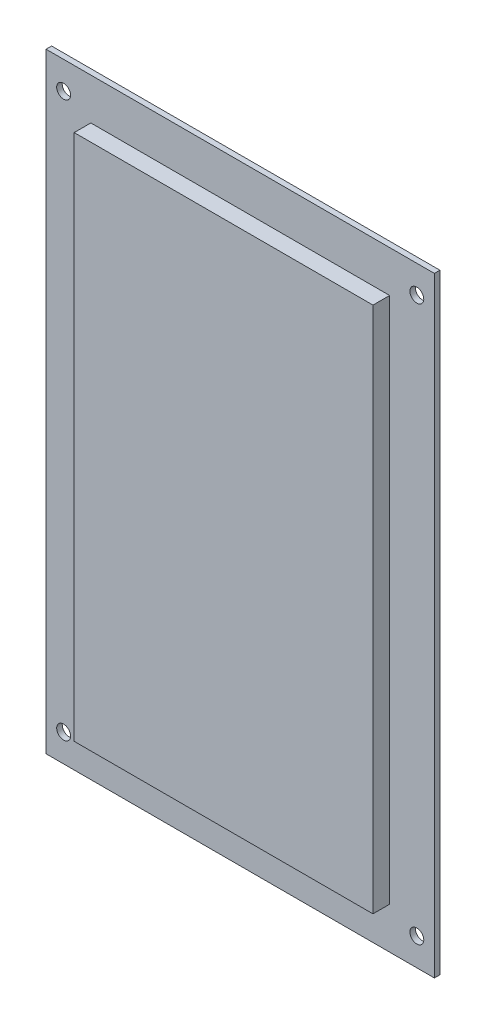
ISO-10303-21;
HEADER;
FILE_DESCRIPTION(('STEP AP214'),'2;1');
FILE_NAME('part.step','',(''),(''),'','','');
FILE_SCHEMA(('AUTOMOTIVE_DESIGN { 1 0 10303 214 1 1 1 1 }'));
ENDSEC;
DATA;
#1=APPLICATION_CONTEXT('core data for automotive mechanical design processes');
#2=APPLICATION_PROTOCOL_DEFINITION('international standard','automotive_design',2000,#1);
#3=PRODUCT_CONTEXT('',#1,'mechanical');
#4=PRODUCT('Part','Part','',(#3));
#5=PRODUCT_RELATED_PRODUCT_CATEGORY('part','',(#4));
#6=PRODUCT_DEFINITION_FORMATION('','',#4);
#7=PRODUCT_DEFINITION_CONTEXT('part definition',#1,'design');
#8=PRODUCT_DEFINITION('design','',#6,#7);
#9=PRODUCT_DEFINITION_SHAPE('','',#8);
#10=(LENGTH_UNIT() NAMED_UNIT(*) SI_UNIT(.MILLI.,.METRE.));
#11=(NAMED_UNIT(*) PLANE_ANGLE_UNIT() SI_UNIT($,.RADIAN.));
#12=(NAMED_UNIT(*) SI_UNIT($,.STERADIAN.) SOLID_ANGLE_UNIT());
#13=UNCERTAINTY_MEASURE_WITH_UNIT(LENGTH_MEASURE(1.E-05),#10,'distance_accuracy_value','');
#14=(GEOMETRIC_REPRESENTATION_CONTEXT(3) GLOBAL_UNCERTAINTY_ASSIGNED_CONTEXT((#13)) GLOBAL_UNIT_ASSIGNED_CONTEXT((#10,
#11,#12)) REPRESENTATION_CONTEXT('',''));
#15=CARTESIAN_POINT('',(0.,0.,0.));
#16=DIRECTION('',(0.,0.,1.));
#17=DIRECTION('',(1.,0.,0.));
#18=AXIS2_PLACEMENT_3D('',#15,#16,#17);
#19=CARTESIAN_POINT('',(-20.0170068027211,43.5850340136054,3.));
#20=DIRECTION('',(1.,0.,0.));
#21=DIRECTION('',(0.,1.,0.));
#22=AXIS2_PLACEMENT_3D('',#19,#20,#21);
#23=PLANE('',#22);
#24=DIRECTION('',(0.,-1.,0.));
#25=VECTOR('',#24,1.);
#26=CARTESIAN_POINT('',(-20.0170068027211,43.5850340136054,0.));
#27=LINE('',#26,#25);
#28=CARTESIAN_POINT('',(-20.0170068027211,43.5850340136054,0.));
#29=VERTEX_POINT('',#28);
#30=CARTESIAN_POINT('',(-20.0170068027211,-51.4549659863945,0.));
#31=VERTEX_POINT('',#30);
#32=EDGE_CURVE('E139',#29,#31,#27,.T.);
#33=ORIENTED_EDGE('',*,*,#32,.T.);
#34=DIRECTION('',(0.,0.,-1.));
#35=VECTOR('',#34,1.);
#36=CARTESIAN_POINT('',(-20.0170068027211,-51.4549659863945,3.));
#37=LINE('',#36,#35);
#38=CARTESIAN_POINT('',(-20.0170068027211,-51.4549659863945,3.));
#39=VERTEX_POINT('',#38);
#40=EDGE_CURVE('E11',#39,#31,#37,.T.);
#41=ORIENTED_EDGE('',*,*,#40,.F.);
#42=DIRECTION('',(0.,-1.,0.));
#43=VECTOR('',#42,1.);
#44=CARTESIAN_POINT('',(-20.0170068027211,43.5850340136054,3.));
#45=LINE('',#44,#43);
#46=CARTESIAN_POINT('',(-20.0170068027211,43.5850340136054,3.));
#47=VERTEX_POINT('',#46);
#48=EDGE_CURVE('E150',#47,#39,#45,.T.);
#49=ORIENTED_EDGE('',*,*,#48,.F.);
#50=DIRECTION('',(0.,0.,-1.));
#51=VECTOR('',#50,1.);
#52=CARTESIAN_POINT('',(-20.0170068027211,43.5850340136054,3.));
#53=LINE('',#52,#51);
#54=EDGE_CURVE('E161',#47,#29,#53,.T.);
#55=ORIENTED_EDGE('',*,*,#54,.T.);
#56=EDGE_LOOP('',(#33,#41,#49,#55));
#57=FACE_BOUND('',#56,.T.);
#58=ADVANCED_FACE('F49',(#57),#23,.F.);
#59=CARTESIAN_POINT('',(-20.0170068027211,-51.4549659863945,3.));
#60=DIRECTION('',(0.,1.,0.));
#61=DIRECTION('',(-1.,0.,0.));
#62=AXIS2_PLACEMENT_3D('',#59,#60,#61);
#63=PLANE('',#62);
#64=DIRECTION('',(1.,0.,0.));
#65=VECTOR('',#64,1.);
#66=CARTESIAN_POINT('',(-20.0170068027211,-51.4549659863945,0.));
#67=LINE('',#66,#65);
#68=CARTESIAN_POINT('',(33.8429931972789,-51.4549659863945,0.));
#69=VERTEX_POINT('',#68);
#70=EDGE_CURVE('E144',#31,#69,#67,.T.);
#71=ORIENTED_EDGE('',*,*,#70,.T.);
#72=DIRECTION('',(0.,0.,-1.));
#73=VECTOR('',#72,1.);
#74=CARTESIAN_POINT('',(33.8429931972789,-51.4549659863945,3.));
#75=LINE('',#74,#73);
#76=CARTESIAN_POINT('',(33.8429931972789,-51.4549659863945,3.));
#77=VERTEX_POINT('',#76);
#78=EDGE_CURVE('E58',#77,#69,#75,.T.);
#79=ORIENTED_EDGE('',*,*,#78,.F.);
#80=DIRECTION('',(1.,0.,0.));
#81=VECTOR('',#80,1.);
#82=CARTESIAN_POINT('',(-20.0170068027211,-51.4549659863945,3.));
#83=LINE('',#82,#81);
#84=EDGE_CURVE('E153',#39,#77,#83,.T.);
#85=ORIENTED_EDGE('',*,*,#84,.F.);
#86=ORIENTED_EDGE('',*,*,#40,.T.);
#87=EDGE_LOOP('',(#71,#79,#85,#86));
#88=FACE_BOUND('',#87,.T.);
#89=ADVANCED_FACE('F188',(#88),#63,.F.);
#90=CARTESIAN_POINT('',(33.8429931972789,43.5850340136055,3.));
#91=DIRECTION('',(-1.,0.,0.));
#92=DIRECTION('',(0.,-1.,0.));
#93=AXIS2_PLACEMENT_3D('',#90,#91,#92);
#94=PLANE('',#93);
#95=DIRECTION('',(0.,1.,0.));
#96=VECTOR('',#95,1.);
#97=CARTESIAN_POINT('',(33.8429931972789,43.5850340136055,0.));
#98=LINE('',#97,#96);
#99=CARTESIAN_POINT('',(33.8429931972789,43.5850340136055,0.));
#100=VERTEX_POINT('',#99);
#101=EDGE_CURVE('E166',#69,#100,#98,.T.);
#102=ORIENTED_EDGE('',*,*,#101,.T.);
#103=DIRECTION('',(0.,0.,-1.));
#104=VECTOR('',#103,1.);
#105=CARTESIAN_POINT('',(33.8429931972789,43.5850340136055,3.));
#106=LINE('',#105,#104);
#107=CARTESIAN_POINT('',(33.8429931972789,43.5850340136055,3.));
#108=VERTEX_POINT('',#107);
#109=EDGE_CURVE('E176',#108,#100,#106,.T.);
#110=ORIENTED_EDGE('',*,*,#109,.F.);
#111=DIRECTION('',(0.,1.,0.));
#112=VECTOR('',#111,1.);
#113=CARTESIAN_POINT('',(33.8429931972789,43.5850340136055,3.));
#114=LINE('',#113,#112);
#115=EDGE_CURVE('E157',#77,#108,#114,.T.);
#116=ORIENTED_EDGE('',*,*,#115,.F.);
#117=ORIENTED_EDGE('',*,*,#78,.T.);
#118=EDGE_LOOP('',(#102,#110,#116,#117));
#119=FACE_BOUND('',#118,.T.);
#120=ADVANCED_FACE('F184',(#119),#94,.F.);
#121=CARTESIAN_POINT('',(-20.0170068027211,43.5850340136054,3.));
#122=DIRECTION('',(0.,-1.,0.));
#123=DIRECTION('',(1.,0.,0.));
#124=AXIS2_PLACEMENT_3D('',#121,#122,#123);
#125=PLANE('',#124);
#126=DIRECTION('',(-1.,0.,0.));
#127=VECTOR('',#126,1.);
#128=CARTESIAN_POINT('',(-20.0170068027211,43.5850340136054,0.));
#129=LINE('',#128,#127);
#130=EDGE_CURVE('E154',#100,#29,#129,.T.);
#131=ORIENTED_EDGE('',*,*,#130,.T.);
#132=ORIENTED_EDGE('',*,*,#54,.F.);
#133=DIRECTION('',(-1.,0.,0.));
#134=VECTOR('',#133,1.);
#135=CARTESIAN_POINT('',(-20.0170068027211,43.5850340136054,3.));
#136=LINE('',#135,#134);
#137=EDGE_CURVE('E65',#108,#47,#136,.T.);
#138=ORIENTED_EDGE('',*,*,#137,.F.);
#139=ORIENTED_EDGE('',*,*,#109,.T.);
#140=EDGE_LOOP('',(#131,#132,#138,#139));
#141=FACE_BOUND('',#140,.T.);
#142=ADVANCED_FACE('F194',(#141),#125,.F.);
#143=CARTESIAN_POINT('',(0.,0.,3.));
#144=DIRECTION('',(0.,0.,1.));
#145=DIRECTION('',(1.,0.,0.));
#146=AXIS2_PLACEMENT_3D('',#143,#144,#145);
#147=PLANE('',#146);
#148=ORIENTED_EDGE('',*,*,#48,.T.);
#149=ORIENTED_EDGE('',*,*,#84,.T.);
#150=ORIENTED_EDGE('',*,*,#115,.T.);
#151=ORIENTED_EDGE('',*,*,#137,.T.);
#152=EDGE_LOOP('',(#148,#149,#150,#151));
#153=FACE_BOUND('',#152,.T.);
#154=ADVANCED_FACE('F197',(#153),#147,.T.);
#155=CARTESIAN_POINT('',(0.,0.,-1.));
#156=DIRECTION('',(0.,0.,-1.));
#157=DIRECTION('',(-1.,0.,0.));
#158=AXIS2_PLACEMENT_3D('',#155,#156,#157);
#159=PLANE('',#158);
#160=CARTESIAN_POINT('',(38.7489293038914,46.0929336097108,-1.));
#161=DIRECTION('',(0.,0.,-1.));
#162=DIRECTION('',(1.,0.,0.));
#163=AXIS2_PLACEMENT_3D('',#160,#161,#162);
#164=CIRCLE('',#163,1.25);
#165=CARTESIAN_POINT('',(39.9989293038914,46.0929336097108,-1.));
#166=VERTEX_POINT('',#165);
#167=EDGE_CURVE('E383',#166,#166,#164,.T.);
#168=ORIENTED_EDGE('',*,*,#167,.F.);
#169=EDGE_LOOP('',(#168));
#170=FACE_BOUND('',#169,.T.);
#171=CARTESIAN_POINT('',(-24.9229429093336,46.0929336097108,-1.));
#172=DIRECTION('',(0.,0.,-1.));
#173=DIRECTION('',(-1.,0.,0.));
#174=AXIS2_PLACEMENT_3D('',#171,#172,#173);
#175=CIRCLE('',#174,1.25);
#176=CARTESIAN_POINT('',(-26.1729429093336,46.0929336097108,-1.));
#177=VERTEX_POINT('',#176);
#178=EDGE_CURVE('E399',#177,#177,#175,.T.);
#179=ORIENTED_EDGE('',*,*,#178,.F.);
#180=EDGE_LOOP('',(#179));
#181=FACE_BOUND('',#180,.T.);
#182=DIRECTION('',(0.,1.,0.));
#183=VECTOR('',#182,1.);
#184=CARTESIAN_POINT('',(-28.0870068027211,51.0650340136055,-1.));
#185=LINE('',#184,#183);
#186=CARTESIAN_POINT('',(-28.0870068027211,-58.9349659863945,-1.));
#187=VERTEX_POINT('',#186);
#188=CARTESIAN_POINT('',(-28.0870068027211,51.0650340136055,-1.));
#189=VERTEX_POINT('',#188);
#190=EDGE_CURVE('E122',#187,#189,#185,.T.);
#191=ORIENTED_EDGE('',*,*,#190,.T.);
#192=DIRECTION('',(1.,0.,0.));
#193=VECTOR('',#192,1.);
#194=CARTESIAN_POINT('',(41.9129931972789,51.0650340136055,-1.));
#195=LINE('',#194,#193);
#196=CARTESIAN_POINT('',(41.9129931972789,51.0650340136055,-1.));
#197=VERTEX_POINT('',#196);
#198=EDGE_CURVE('E110',#189,#197,#195,.T.);
#199=ORIENTED_EDGE('',*,*,#198,.T.);
#200=DIRECTION('',(0.,-1.,0.));
#201=VECTOR('',#200,1.);
#202=CARTESIAN_POINT('',(41.9129931972789,51.0650340136055,-1.));
#203=LINE('',#202,#201);
#204=CARTESIAN_POINT('',(41.9129931972789,-58.9349659863945,-1.));
#205=VERTEX_POINT('',#204);
#206=EDGE_CURVE('E121',#197,#205,#203,.T.);
#207=ORIENTED_EDGE('',*,*,#206,.T.);
#208=DIRECTION('',(-1.,0.,0.));
#209=VECTOR('',#208,1.);
#210=CARTESIAN_POINT('',(41.9129931972789,-58.9349659863945,-1.));
#211=LINE('',#210,#209);
#212=EDGE_CURVE('E128',#205,#187,#211,.T.);
#213=ORIENTED_EDGE('',*,*,#212,.T.);
#214=EDGE_LOOP('',(#191,#199,#207,#213));
#215=FACE_BOUND('',#214,.T.);
#216=CARTESIAN_POINT('',(-24.9229429093336,-53.9628655824999,-1.));
#217=DIRECTION('',(0.,0.,-1.));
#218=DIRECTION('',(-1.,0.,0.));
#219=AXIS2_PLACEMENT_3D('',#216,#217,#218);
#220=CIRCLE('',#219,1.25);
#221=CARTESIAN_POINT('',(-26.1729429093336,-53.9628655824999,-1.));
#222=VERTEX_POINT('',#221);
#223=EDGE_CURVE('E391',#222,#222,#220,.T.);
#224=ORIENTED_EDGE('',*,*,#223,.F.);
#225=EDGE_LOOP('',(#224));
#226=FACE_BOUND('',#225,.T.);
#227=CARTESIAN_POINT('',(38.7489293038914,-53.9628655824999,-1.));
#228=DIRECTION('',(0.,0.,-1.));
#229=DIRECTION('',(1.,0.,0.));
#230=AXIS2_PLACEMENT_3D('',#227,#228,#229);
#231=CIRCLE('',#230,1.25);
#232=CARTESIAN_POINT('',(39.9989293038914,-53.9628655824999,-1.));
#233=VERTEX_POINT('',#232);
#234=EDGE_CURVE('E372',#233,#233,#231,.T.);
#235=ORIENTED_EDGE('',*,*,#234,.F.);
#236=EDGE_LOOP('',(#235));
#237=FACE_BOUND('',#236,.T.);
#238=ADVANCED_FACE('F125',(#170,#181,#215,#226,#237),#159,.T.);
#239=CARTESIAN_POINT('',(0.,0.,0.));
#240=DIRECTION('',(0.,0.,-1.));
#241=DIRECTION('',(-1.,0.,0.));
#242=AXIS2_PLACEMENT_3D('',#239,#240,#241);
#243=PLANE('',#242);
#244=ORIENTED_EDGE('',*,*,#32,.F.);
#245=ORIENTED_EDGE('',*,*,#130,.F.);
#246=ORIENTED_EDGE('',*,*,#101,.F.);
#247=ORIENTED_EDGE('',*,*,#70,.F.);
#248=EDGE_LOOP('',(#244,#245,#246,#247));
#249=FACE_BOUND('',#248,.T.);
#250=DIRECTION('',(0.,1.,0.));
#251=VECTOR('',#250,1.);
#252=CARTESIAN_POINT('',(-28.0870068027211,51.0650340136055,0.));
#253=LINE('',#252,#251);
#254=CARTESIAN_POINT('',(-28.0870068027211,-58.9349659863945,0.));
#255=VERTEX_POINT('',#254);
#256=CARTESIAN_POINT('',(-28.0870068027211,51.0650340136055,0.));
#257=VERTEX_POINT('',#256);
#258=EDGE_CURVE('E137',#255,#257,#253,.T.);
#259=ORIENTED_EDGE('',*,*,#258,.F.);
#260=DIRECTION('',(-1.,0.,0.));
#261=VECTOR('',#260,1.);
#262=CARTESIAN_POINT('',(41.9129931972789,-58.9349659863945,0.));
#263=LINE('',#262,#261);
#264=CARTESIAN_POINT('',(41.9129931972789,-58.9349659863945,0.));
#265=VERTEX_POINT('',#264);
#266=EDGE_CURVE('E133',#265,#255,#263,.T.);
#267=ORIENTED_EDGE('',*,*,#266,.F.);
#268=DIRECTION('',(0.,-1.,0.));
#269=VECTOR('',#268,1.);
#270=CARTESIAN_POINT('',(41.9129931972789,51.0650340136055,0.));
#271=LINE('',#270,#269);
#272=CARTESIAN_POINT('',(41.9129931972789,51.0650340136055,0.));
#273=VERTEX_POINT('',#272);
#274=EDGE_CURVE('E416',#273,#265,#271,.T.);
#275=ORIENTED_EDGE('',*,*,#274,.F.);
#276=DIRECTION('',(1.,0.,0.));
#277=VECTOR('',#276,1.);
#278=CARTESIAN_POINT('',(41.9129931972789,51.0650340136055,0.));
#279=LINE('',#278,#277);
#280=EDGE_CURVE('E413',#257,#273,#279,.T.);
#281=ORIENTED_EDGE('',*,*,#280,.F.);
#282=EDGE_LOOP('',(#259,#267,#275,#281));
#283=FACE_BOUND('',#282,.T.);
#284=CARTESIAN_POINT('',(-24.9229429093336,46.0929336097108,0.));
#285=DIRECTION('',(0.,0.,-1.));
#286=DIRECTION('',(-1.,0.,0.));
#287=AXIS2_PLACEMENT_3D('',#284,#285,#286);
#288=CIRCLE('',#287,1.25);
#289=CARTESIAN_POINT('',(-26.1729429093336,46.0929336097108,0.));
#290=VERTEX_POINT('',#289);
#291=EDGE_CURVE('E395',#290,#290,#288,.T.);
#292=ORIENTED_EDGE('',*,*,#291,.T.);
#293=EDGE_LOOP('',(#292));
#294=FACE_BOUND('',#293,.T.);
#295=CARTESIAN_POINT('',(-24.9229429093336,-53.9628655824999,0.));
#296=DIRECTION('',(0.,0.,-1.));
#297=DIRECTION('',(-1.,0.,0.));
#298=AXIS2_PLACEMENT_3D('',#295,#296,#297);
#299=CIRCLE('',#298,1.25);
#300=CARTESIAN_POINT('',(-26.1729429093336,-53.9628655824999,0.));
#301=VERTEX_POINT('',#300);
#302=EDGE_CURVE('E387',#301,#301,#299,.T.);
#303=ORIENTED_EDGE('',*,*,#302,.T.);
#304=EDGE_LOOP('',(#303));
#305=FACE_BOUND('',#304,.T.);
#306=CARTESIAN_POINT('',(38.7489293038914,46.0929336097108,0.));
#307=DIRECTION('',(0.,0.,-1.));
#308=DIRECTION('',(1.,0.,0.));
#309=AXIS2_PLACEMENT_3D('',#306,#307,#308);
#310=CIRCLE('',#309,1.25);
#311=CARTESIAN_POINT('',(39.9989293038914,46.0929336097108,0.));
#312=VERTEX_POINT('',#311);
#313=EDGE_CURVE('E380',#312,#312,#310,.T.);
#314=ORIENTED_EDGE('',*,*,#313,.T.);
#315=EDGE_LOOP('',(#314));
#316=FACE_BOUND('',#315,.T.);
#317=CARTESIAN_POINT('',(38.7489293038914,-53.9628655824999,0.));
#318=DIRECTION('',(0.,0.,-1.));
#319=DIRECTION('',(1.,0.,0.));
#320=AXIS2_PLACEMENT_3D('',#317,#318,#319);
#321=CIRCLE('',#320,1.25);
#322=CARTESIAN_POINT('',(39.9989293038914,-53.9628655824999,0.));
#323=VERTEX_POINT('',#322);
#324=EDGE_CURVE('E375',#323,#323,#321,.T.);
#325=ORIENTED_EDGE('',*,*,#324,.T.);
#326=EDGE_LOOP('',(#325));
#327=FACE_BOUND('',#326,.T.);
#328=ADVANCED_FACE('F191',(#249,#283,#294,#305,#316,#327),#243,.F.);
#329=CARTESIAN_POINT('',(-28.0870068027211,51.0650340136055,-1.));
#330=DIRECTION('',(1.,0.,0.));
#331=DIRECTION('',(0.,1.,0.));
#332=AXIS2_PLACEMENT_3D('',#329,#330,#331);
#333=PLANE('',#332);
#334=ORIENTED_EDGE('',*,*,#258,.T.);
#335=DIRECTION('',(0.,0.,1.));
#336=VECTOR('',#335,1.);
#337=CARTESIAN_POINT('',(-28.0870068027211,51.0650340136055,-1.));
#338=LINE('',#337,#336);
#339=EDGE_CURVE('E114',#189,#257,#338,.T.);
#340=ORIENTED_EDGE('',*,*,#339,.F.);
#341=ORIENTED_EDGE('',*,*,#190,.F.);
#342=DIRECTION('',(0.,0.,1.));
#343=VECTOR('',#342,1.);
#344=CARTESIAN_POINT('',(-28.0870068027211,-58.9349659863945,-1.));
#345=LINE('',#344,#343);
#346=EDGE_CURVE('E410',#187,#255,#345,.T.);
#347=ORIENTED_EDGE('',*,*,#346,.T.);
#348=EDGE_LOOP('',(#334,#340,#341,#347));
#349=FACE_BOUND('',#348,.T.);
#350=ADVANCED_FACE('F135',(#349),#333,.F.);
#351=CARTESIAN_POINT('',(41.9129931972789,51.0650340136055,-1.));
#352=DIRECTION('',(0.,-1.,0.));
#353=DIRECTION('',(0.,0.,-1.));
#354=AXIS2_PLACEMENT_3D('',#351,#352,#353);
#355=PLANE('',#354);
#356=ORIENTED_EDGE('',*,*,#280,.T.);
#357=DIRECTION('',(0.,0.,1.));
#358=VECTOR('',#357,1.);
#359=CARTESIAN_POINT('',(41.9129931972789,51.0650340136055,-1.));
#360=LINE('',#359,#358);
#361=EDGE_CURVE('E117',#197,#273,#360,.T.);
#362=ORIENTED_EDGE('',*,*,#361,.F.);
#363=ORIENTED_EDGE('',*,*,#198,.F.);
#364=ORIENTED_EDGE('',*,*,#339,.T.);
#365=EDGE_LOOP('',(#356,#362,#363,#364));
#366=FACE_BOUND('',#365,.T.);
#367=ADVANCED_FACE('F112',(#366),#355,.F.);
#368=CARTESIAN_POINT('',(41.9129931972789,51.0650340136055,-1.));
#369=DIRECTION('',(-1.,0.,0.));
#370=DIRECTION('',(0.,-1.,0.));
#371=AXIS2_PLACEMENT_3D('',#368,#369,#370);
#372=PLANE('',#371);
#373=ORIENTED_EDGE('',*,*,#274,.T.);
#374=DIRECTION('',(0.,0.,1.));
#375=VECTOR('',#374,1.);
#376=CARTESIAN_POINT('',(41.9129931972789,-58.9349659863945,-1.));
#377=LINE('',#376,#375);
#378=EDGE_CURVE('E146',#205,#265,#377,.T.);
#379=ORIENTED_EDGE('',*,*,#378,.F.);
#380=ORIENTED_EDGE('',*,*,#206,.F.);
#381=ORIENTED_EDGE('',*,*,#361,.T.);
#382=EDGE_LOOP('',(#373,#379,#380,#381));
#383=FACE_BOUND('',#382,.T.);
#384=ADVANCED_FACE('F259',(#383),#372,.F.);
#385=CARTESIAN_POINT('',(41.9129931972789,-58.9349659863945,-1.));
#386=DIRECTION('',(0.,1.,0.));
#387=DIRECTION('',(0.,0.,1.));
#388=AXIS2_PLACEMENT_3D('',#385,#386,#387);
#389=PLANE('',#388);
#390=ORIENTED_EDGE('',*,*,#266,.T.);
#391=ORIENTED_EDGE('',*,*,#346,.F.);
#392=ORIENTED_EDGE('',*,*,#212,.F.);
#393=ORIENTED_EDGE('',*,*,#378,.T.);
#394=EDGE_LOOP('',(#390,#391,#392,#393));
#395=FACE_BOUND('',#394,.T.);
#396=ADVANCED_FACE('F270',(#395),#389,.F.);
#397=CARTESIAN_POINT('',(-24.9229429093336,46.0929336097108,-1.));
#398=DIRECTION('',(0.,0.,1.));
#399=DIRECTION('',(1.,0.,0.));
#400=AXIS2_PLACEMENT_3D('',#397,#398,#399);
#401=CYLINDRICAL_SURFACE('',#400,1.25);
#402=ORIENTED_EDGE('',*,*,#178,.T.);
#403=EDGE_LOOP('',(#402));
#404=FACE_BOUND('',#403,.T.);
#405=ORIENTED_EDGE('',*,*,#291,.F.);
#406=EDGE_LOOP('',(#405));
#407=FACE_BOUND('',#406,.T.);
#408=ADVANCED_FACE('F282',(#404,#407),#401,.F.);
#409=CARTESIAN_POINT('',(-24.9229429093336,-53.9628655824999,-1.));
#410=DIRECTION('',(0.,0.,1.));
#411=DIRECTION('',(1.,0.,0.));
#412=AXIS2_PLACEMENT_3D('',#409,#410,#411);
#413=CYLINDRICAL_SURFACE('',#412,1.25);
#414=ORIENTED_EDGE('',*,*,#223,.T.);
#415=EDGE_LOOP('',(#414));
#416=FACE_BOUND('',#415,.T.);
#417=ORIENTED_EDGE('',*,*,#302,.F.);
#418=EDGE_LOOP('',(#417));
#419=FACE_BOUND('',#418,.T.);
#420=ADVANCED_FACE('F294',(#416,#419),#413,.F.);
#421=CARTESIAN_POINT('',(38.7489293038914,46.0929336097108,-1.));
#422=DIRECTION('',(0.,0.,1.));
#423=DIRECTION('',(1.,0.,0.));
#424=AXIS2_PLACEMENT_3D('',#421,#422,#423);
#425=CYLINDRICAL_SURFACE('',#424,1.25);
#426=ORIENTED_EDGE('',*,*,#167,.T.);
#427=EDGE_LOOP('',(#426));
#428=FACE_BOUND('',#427,.T.);
#429=ORIENTED_EDGE('',*,*,#313,.F.);
#430=EDGE_LOOP('',(#429));
#431=FACE_BOUND('',#430,.T.);
#432=ADVANCED_FACE('F306',(#428,#431),#425,.F.);
#433=CARTESIAN_POINT('',(38.7489293038914,-53.9628655824999,-1.));
#434=DIRECTION('',(0.,0.,1.));
#435=DIRECTION('',(1.,0.,0.));
#436=AXIS2_PLACEMENT_3D('',#433,#434,#435);
#437=CYLINDRICAL_SURFACE('',#436,1.25);
#438=ORIENTED_EDGE('',*,*,#234,.T.);
#439=EDGE_LOOP('',(#438));
#440=FACE_BOUND('',#439,.T.);
#441=ORIENTED_EDGE('',*,*,#324,.F.);
#442=EDGE_LOOP('',(#441));
#443=FACE_BOUND('',#442,.T.);
#444=ADVANCED_FACE('F318',(#440,#443),#437,.F.);
#445=CLOSED_SHELL('',(#58,#89,#120,#142,#154,#238,#328,#350,#367,#384,#396,#408,#420,#432,#444));
#446=MANIFOLD_SOLID_BREP('B2',#445);
#447=ADVANCED_BREP_SHAPE_REPRESENTATION('',(#18,#446),#14);
#448=SHAPE_DEFINITION_REPRESENTATION(#9,#447);
ENDSEC;
END-ISO-10303-21;
